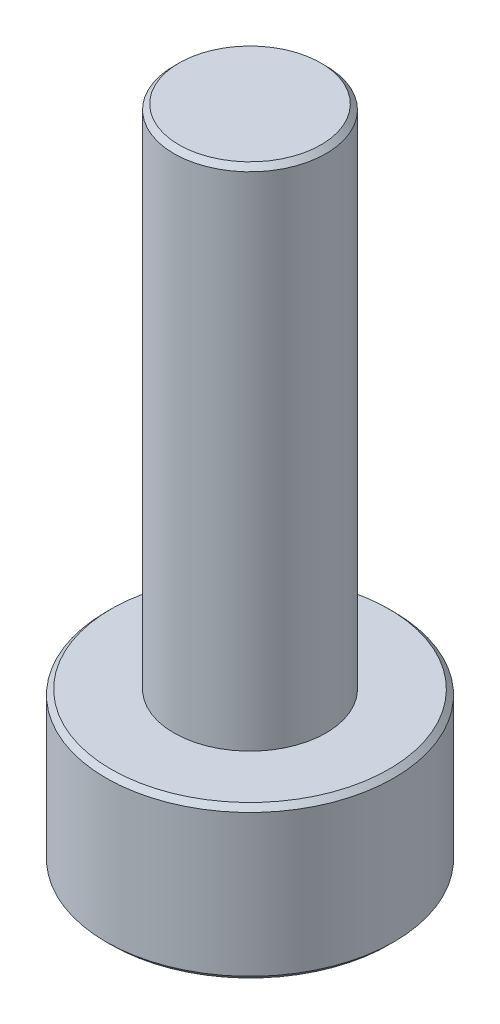
ISO-10303-21;
HEADER;
FILE_DESCRIPTION(('STEP AP214'),'2;1');
FILE_NAME('part.step','',(''),(''),'','','');
FILE_SCHEMA(('AUTOMOTIVE_DESIGN { 1 0 10303 214 1 1 1 1 }'));
ENDSEC;
DATA;
#1=APPLICATION_CONTEXT('core data for automotive mechanical design processes');
#2=APPLICATION_PROTOCOL_DEFINITION('international standard','automotive_design',2000,#1);
#3=PRODUCT_CONTEXT('',#1,'mechanical');
#4=PRODUCT('Part','Part','',(#3));
#5=PRODUCT_RELATED_PRODUCT_CATEGORY('part','',(#4));
#6=PRODUCT_DEFINITION_FORMATION('','',#4);
#7=PRODUCT_DEFINITION_CONTEXT('part definition',#1,'design');
#8=PRODUCT_DEFINITION('design','',#6,#7);
#9=PRODUCT_DEFINITION_SHAPE('','',#8);
#10=(LENGTH_UNIT() NAMED_UNIT(*) SI_UNIT(.MILLI.,.METRE.));
#11=(NAMED_UNIT(*) PLANE_ANGLE_UNIT() SI_UNIT($,.RADIAN.));
#12=(NAMED_UNIT(*) SI_UNIT($,.STERADIAN.) SOLID_ANGLE_UNIT());
#13=UNCERTAINTY_MEASURE_WITH_UNIT(LENGTH_MEASURE(1.E-05),#10,'distance_accuracy_value','');
#14=(GEOMETRIC_REPRESENTATION_CONTEXT(3) GLOBAL_UNCERTAINTY_ASSIGNED_CONTEXT((#13)) GLOBAL_UNIT_ASSIGNED_CONTEXT((#10,
#11,#12)) REPRESENTATION_CONTEXT('',''));
#15=CARTESIAN_POINT('',(0.,0.,0.));
#16=DIRECTION('',(0.,0.,1.));
#17=DIRECTION('',(1.,0.,0.));
#18=AXIS2_PLACEMENT_3D('',#15,#16,#17);
#19=CARTESIAN_POINT('',(0.,3.,0.));
#20=DIRECTION('',(0.,-1.,0.));
#21=DIRECTION('',(0.,0.,-1.));
#22=AXIS2_PLACEMENT_3D('',#19,#20,#21);
#23=CYLINDRICAL_SURFACE('',#22,2.84);
#24=CARTESIAN_POINT('',(0.,2.9,0.));
#25=DIRECTION('',(0.,1.,0.));
#26=DIRECTION('',(0.,0.,1.));
#27=AXIS2_PLACEMENT_3D('',#24,#25,#26);
#28=CIRCLE('',#27,2.84);
#29=CARTESIAN_POINT('',(0.,2.9,2.84));
#30=VERTEX_POINT('',#29);
#31=EDGE_CURVE('E51',#30,#30,#28,.F.);
#32=ORIENTED_EDGE('',*,*,#31,.T.);
#33=EDGE_LOOP('',(#32));
#34=FACE_BOUND('',#33,.T.);
#35=CARTESIAN_POINT('',(0.,0.100000000000001,0.));
#36=DIRECTION('',(0.,1.,0.));
#37=DIRECTION('',(0.,0.,1.));
#38=AXIS2_PLACEMENT_3D('',#35,#36,#37);
#39=CIRCLE('',#38,2.84);
#40=CARTESIAN_POINT('',(0.,0.100000000000001,2.84));
#41=VERTEX_POINT('',#40);
#42=EDGE_CURVE('E162',#41,#41,#39,.T.);
#43=ORIENTED_EDGE('',*,*,#42,.T.);
#44=EDGE_LOOP('',(#43));
#45=FACE_BOUND('',#44,.T.);
#46=ADVANCED_FACE('F43',(#34,#45),#23,.T.);
#47=CARTESIAN_POINT('',(0.,3.,0.));
#48=DIRECTION('',(0.,1.,0.));
#49=DIRECTION('',(0.,0.,1.));
#50=AXIS2_PLACEMENT_3D('',#47,#48,#49);
#51=PLANE('',#50);
#52=CARTESIAN_POINT('',(0.,3.,0.));
#53=DIRECTION('',(0.,1.,0.));
#54=DIRECTION('',(0.,0.,1.));
#55=AXIS2_PLACEMENT_3D('',#52,#53,#54);
#56=CIRCLE('',#55,2.74);
#57=CARTESIAN_POINT('',(0.,3.,2.74));
#58=VERTEX_POINT('',#57);
#59=EDGE_CURVE('E159',#58,#58,#56,.T.);
#60=ORIENTED_EDGE('',*,*,#59,.T.);
#61=EDGE_LOOP('',(#60));
#62=FACE_BOUND('',#61,.T.);
#63=CARTESIAN_POINT('',(0.,3.,0.));
#64=DIRECTION('',(0.,1.,0.));
#65=DIRECTION('',(0.,0.,1.));
#66=AXIS2_PLACEMENT_3D('',#63,#64,#65);
#67=CIRCLE('',#66,1.5);
#68=CARTESIAN_POINT('',(0.,3.,1.5));
#69=VERTEX_POINT('',#68);
#70=EDGE_CURVE('E145',#69,#69,#67,.T.);
#71=ORIENTED_EDGE('',*,*,#70,.F.);
#72=EDGE_LOOP('',(#71));
#73=FACE_BOUND('',#72,.T.);
#74=ADVANCED_FACE('F175',(#62,#73),#51,.T.);
#75=CARTESIAN_POINT('',(0.,0.,0.));
#76=DIRECTION('',(0.,1.,0.));
#77=DIRECTION('',(0.,0.,1.));
#78=AXIS2_PLACEMENT_3D('',#75,#76,#77);
#79=PLANE('',#78);
#80=CARTESIAN_POINT('',(0.,0.,0.));
#81=DIRECTION('',(0.,1.,0.));
#82=DIRECTION('',(0.,0.,1.));
#83=AXIS2_PLACEMENT_3D('',#80,#81,#82);
#84=CIRCLE('',#83,2.74);
#85=CARTESIAN_POINT('',(0.,0.,2.74));
#86=VERTEX_POINT('',#85);
#87=EDGE_CURVE('E11',#86,#86,#84,.F.);
#88=ORIENTED_EDGE('',*,*,#87,.T.);
#89=EDGE_LOOP('',(#88));
#90=FACE_BOUND('',#89,.T.);
#91=DIRECTION('',(0.,0.,1.));
#92=VECTOR('',#91,1.);
#93=CARTESIAN_POINT('',(1.29,0.,-0.744781847254618));
#94=LINE('',#93,#92);
#95=CARTESIAN_POINT('',(1.29,0.,-0.744781847254618));
#96=VERTEX_POINT('',#95);
#97=CARTESIAN_POINT('',(1.29,0.,0.744781847254619));
#98=VERTEX_POINT('',#97);
#99=EDGE_CURVE('E132',#96,#98,#94,.T.);
#100=ORIENTED_EDGE('',*,*,#99,.F.);
#101=DIRECTION('',(0.866025403784439,0.,0.5));
#102=VECTOR('',#101,1.);
#103=CARTESIAN_POINT('',(0.,0.,-1.48956369450924));
#104=LINE('',#103,#102);
#105=CARTESIAN_POINT('',(0.,0.,-1.48956369450924));
#106=VERTEX_POINT('',#105);
#107=EDGE_CURVE('E58',#106,#96,#104,.T.);
#108=ORIENTED_EDGE('',*,*,#107,.F.);
#109=DIRECTION('',(0.866025403784439,0.,-0.5));
#110=VECTOR('',#109,1.);
#111=CARTESIAN_POINT('',(-1.29,0.,-0.744781847254618));
#112=LINE('',#111,#110);
#113=CARTESIAN_POINT('',(-1.29,0.,-0.744781847254618));
#114=VERTEX_POINT('',#113);
#115=EDGE_CURVE('E141',#114,#106,#112,.T.);
#116=ORIENTED_EDGE('',*,*,#115,.F.);
#117=DIRECTION('',(0.,0.,-1.));
#118=VECTOR('',#117,1.);
#119=CARTESIAN_POINT('',(-1.29,0.,0.744781847254619));
#120=LINE('',#119,#118);
#121=CARTESIAN_POINT('',(-1.29,0.,0.744781847254619));
#122=VERTEX_POINT('',#121);
#123=EDGE_CURVE('E139',#122,#114,#120,.T.);
#124=ORIENTED_EDGE('',*,*,#123,.F.);
#125=DIRECTION('',(-0.866025403784439,0.,-0.5));
#126=VECTOR('',#125,1.);
#127=CARTESIAN_POINT('',(0.,0.,1.48956369450924));
#128=LINE('',#127,#126);
#129=CARTESIAN_POINT('',(0.,0.,1.48956369450924));
#130=VERTEX_POINT('',#129);
#131=EDGE_CURVE('E106',#130,#122,#128,.T.);
#132=ORIENTED_EDGE('',*,*,#131,.F.);
#133=DIRECTION('',(-0.866025403784439,0.,0.5));
#134=VECTOR('',#133,1.);
#135=CARTESIAN_POINT('',(1.29,0.,0.744781847254619));
#136=LINE('',#135,#134);
#137=EDGE_CURVE('E135',#98,#130,#136,.T.);
#138=ORIENTED_EDGE('',*,*,#137,.F.);
#139=EDGE_LOOP('',(#100,#108,#116,#124,#132,#138));
#140=FACE_BOUND('',#139,.T.);
#141=ADVANCED_FACE('F178',(#90,#140),#79,.F.);
#142=CARTESIAN_POINT('',(0.,13.,0.));
#143=DIRECTION('',(0.,-1.,0.));
#144=DIRECTION('',(0.,0.,-1.));
#145=AXIS2_PLACEMENT_3D('',#142,#143,#144);
#146=CYLINDRICAL_SURFACE('',#145,1.5);
#147=CARTESIAN_POINT('',(0.,12.9,0.));
#148=DIRECTION('',(0.,1.,0.));
#149=DIRECTION('',(0.,0.,1.));
#150=AXIS2_PLACEMENT_3D('',#147,#148,#149);
#151=CIRCLE('',#150,1.5);
#152=CARTESIAN_POINT('',(0.,12.9,1.5));
#153=VERTEX_POINT('',#152);
#154=EDGE_CURVE('E156',#153,#153,#151,.F.);
#155=ORIENTED_EDGE('',*,*,#154,.T.);
#156=EDGE_LOOP('',(#155));
#157=FACE_BOUND('',#156,.T.);
#158=ORIENTED_EDGE('',*,*,#70,.T.);
#159=EDGE_LOOP('',(#158));
#160=FACE_BOUND('',#159,.T.);
#161=ADVANCED_FACE('F182',(#157,#160),#146,.T.);
#162=CARTESIAN_POINT('',(0.,13.,0.));
#163=DIRECTION('',(0.,1.,0.));
#164=DIRECTION('',(0.,0.,1.));
#165=AXIS2_PLACEMENT_3D('',#162,#163,#164);
#166=PLANE('',#165);
#167=CARTESIAN_POINT('',(0.,13.,0.));
#168=DIRECTION('',(0.,1.,0.));
#169=DIRECTION('',(0.,0.,1.));
#170=AXIS2_PLACEMENT_3D('',#167,#168,#169);
#171=CIRCLE('',#170,1.4);
#172=CARTESIAN_POINT('',(0.,13.,1.4));
#173=VERTEX_POINT('',#172);
#174=EDGE_CURVE('E153',#173,#173,#171,.T.);
#175=ORIENTED_EDGE('',*,*,#174,.T.);
#176=EDGE_LOOP('',(#175));
#177=FACE_BOUND('',#176,.T.);
#178=ADVANCED_FACE('F184',(#177),#166,.T.);
#179=CARTESIAN_POINT('',(0.,1.3,-1.48956369450924));
#180=DIRECTION('',(0.5,0.,-0.866025403784439));
#181=DIRECTION('',(-0.866025403784439,0.,-0.5));
#182=AXIS2_PLACEMENT_3D('',#179,#180,#181);
#183=PLANE('',#182);
#184=ORIENTED_EDGE('',*,*,#107,.T.);
#185=DIRECTION('',(0.,-1.,0.));
#186=VECTOR('',#185,1.);
#187=CARTESIAN_POINT('',(1.29,1.3,-0.744781847254618));
#188=LINE('',#187,#186);
#189=CARTESIAN_POINT('',(1.29,1.3,-0.744781847254618));
#190=VERTEX_POINT('',#189);
#191=EDGE_CURVE('E88',#190,#96,#188,.T.);
#192=ORIENTED_EDGE('',*,*,#191,.F.);
#193=DIRECTION('',(0.866025403784439,0.,0.5));
#194=VECTOR('',#193,1.);
#195=CARTESIAN_POINT('',(0.,1.3,-1.48956369450924));
#196=LINE('',#195,#194);
#197=CARTESIAN_POINT('',(0.,1.3,-1.48956369450924));
#198=VERTEX_POINT('',#197);
#199=EDGE_CURVE('E143',#198,#190,#196,.T.);
#200=ORIENTED_EDGE('',*,*,#199,.F.);
#201=DIRECTION('',(0.,-1.,0.));
#202=VECTOR('',#201,1.);
#203=CARTESIAN_POINT('',(0.,1.3,-1.48956369450924));
#204=LINE('',#203,#202);
#205=EDGE_CURVE('E66',#198,#106,#204,.T.);
#206=ORIENTED_EDGE('',*,*,#205,.T.);
#207=EDGE_LOOP('',(#184,#192,#200,#206));
#208=FACE_BOUND('',#207,.T.);
#209=ADVANCED_FACE('F191',(#208),#183,.F.);
#210=CARTESIAN_POINT('',(-1.29,1.3,-0.744781847254618));
#211=DIRECTION('',(-0.5,0.,-0.866025403784439));
#212=DIRECTION('',(-0.866025403784439,0.,0.5));
#213=AXIS2_PLACEMENT_3D('',#210,#211,#212);
#214=PLANE('',#213);
#215=ORIENTED_EDGE('',*,*,#115,.T.);
#216=ORIENTED_EDGE('',*,*,#205,.F.);
#217=DIRECTION('',(0.866025403784439,0.,-0.5));
#218=VECTOR('',#217,1.);
#219=CARTESIAN_POINT('',(-1.29,1.3,-0.744781847254618));
#220=LINE('',#219,#218);
#221=CARTESIAN_POINT('',(-1.29,1.3,-0.744781847254618));
#222=VERTEX_POINT('',#221);
#223=EDGE_CURVE('E118',#222,#198,#220,.T.);
#224=ORIENTED_EDGE('',*,*,#223,.F.);
#225=DIRECTION('',(0.,-1.,0.));
#226=VECTOR('',#225,1.);
#227=CARTESIAN_POINT('',(-1.29,1.3,-0.744781847254618));
#228=LINE('',#227,#226);
#229=EDGE_CURVE('E110',#222,#114,#228,.T.);
#230=ORIENTED_EDGE('',*,*,#229,.T.);
#231=EDGE_LOOP('',(#215,#216,#224,#230));
#232=FACE_BOUND('',#231,.T.);
#233=ADVANCED_FACE('F218',(#232),#214,.F.);
#234=CARTESIAN_POINT('',(-1.29,1.3,0.744781847254619));
#235=DIRECTION('',(-1.,0.,0.));
#236=DIRECTION('',(0.,0.,1.));
#237=AXIS2_PLACEMENT_3D('',#234,#235,#236);
#238=PLANE('',#237);
#239=ORIENTED_EDGE('',*,*,#123,.T.);
#240=ORIENTED_EDGE('',*,*,#229,.F.);
#241=DIRECTION('',(0.,0.,-1.));
#242=VECTOR('',#241,1.);
#243=CARTESIAN_POINT('',(-1.29,1.3,0.744781847254619));
#244=LINE('',#243,#242);
#245=CARTESIAN_POINT('',(-1.29,1.3,0.744781847254619));
#246=VERTEX_POINT('',#245);
#247=EDGE_CURVE('E114',#246,#222,#244,.T.);
#248=ORIENTED_EDGE('',*,*,#247,.F.);
#249=DIRECTION('',(0.,-1.,0.));
#250=VECTOR('',#249,1.);
#251=CARTESIAN_POINT('',(-1.29,1.3,0.744781847254619));
#252=LINE('',#251,#250);
#253=EDGE_CURVE('E99',#246,#122,#252,.T.);
#254=ORIENTED_EDGE('',*,*,#253,.T.);
#255=EDGE_LOOP('',(#239,#240,#248,#254));
#256=FACE_BOUND('',#255,.T.);
#257=ADVANCED_FACE('F115',(#256),#238,.F.);
#258=CARTESIAN_POINT('',(0.,1.3,1.48956369450924));
#259=DIRECTION('',(-0.5,0.,0.866025403784439));
#260=DIRECTION('',(0.866025403784439,0.,0.5));
#261=AXIS2_PLACEMENT_3D('',#258,#259,#260);
#262=PLANE('',#261);
#263=ORIENTED_EDGE('',*,*,#131,.T.);
#264=ORIENTED_EDGE('',*,*,#253,.F.);
#265=DIRECTION('',(-0.866025403784439,0.,-0.5));
#266=VECTOR('',#265,1.);
#267=CARTESIAN_POINT('',(0.,1.3,1.48956369450924));
#268=LINE('',#267,#266);
#269=CARTESIAN_POINT('',(0.,1.3,1.48956369450924));
#270=VERTEX_POINT('',#269);
#271=EDGE_CURVE('E103',#270,#246,#268,.T.);
#272=ORIENTED_EDGE('',*,*,#271,.F.);
#273=DIRECTION('',(0.,-1.,0.));
#274=VECTOR('',#273,1.);
#275=CARTESIAN_POINT('',(0.,1.3,1.48956369450924));
#276=LINE('',#275,#274);
#277=EDGE_CURVE('E111',#270,#130,#276,.T.);
#278=ORIENTED_EDGE('',*,*,#277,.T.);
#279=EDGE_LOOP('',(#263,#264,#272,#278));
#280=FACE_BOUND('',#279,.T.);
#281=ADVANCED_FACE('F101',(#280),#262,.F.);
#282=CARTESIAN_POINT('',(1.29,1.3,0.744781847254619));
#283=DIRECTION('',(0.5,0.,0.866025403784439));
#284=DIRECTION('',(0.866025403784439,0.,-0.5));
#285=AXIS2_PLACEMENT_3D('',#282,#283,#284);
#286=PLANE('',#285);
#287=ORIENTED_EDGE('',*,*,#137,.T.);
#288=ORIENTED_EDGE('',*,*,#277,.F.);
#289=DIRECTION('',(-0.866025403784439,0.,0.5));
#290=VECTOR('',#289,1.);
#291=CARTESIAN_POINT('',(1.29,1.3,0.744781847254619));
#292=LINE('',#291,#290);
#293=CARTESIAN_POINT('',(1.29,1.3,0.744781847254619));
#294=VERTEX_POINT('',#293);
#295=EDGE_CURVE('E124',#294,#270,#292,.T.);
#296=ORIENTED_EDGE('',*,*,#295,.F.);
#297=DIRECTION('',(0.,-1.,0.));
#298=VECTOR('',#297,1.);
#299=CARTESIAN_POINT('',(1.29,1.3,0.744781847254619));
#300=LINE('',#299,#298);
#301=EDGE_CURVE('E148',#294,#98,#300,.T.);
#302=ORIENTED_EDGE('',*,*,#301,.T.);
#303=EDGE_LOOP('',(#287,#288,#296,#302));
#304=FACE_BOUND('',#303,.T.);
#305=ADVANCED_FACE('F214',(#304),#286,.F.);
#306=CARTESIAN_POINT('',(1.29,1.3,-0.744781847254618));
#307=DIRECTION('',(1.,0.,0.));
#308=DIRECTION('',(0.,0.,-1.));
#309=AXIS2_PLACEMENT_3D('',#306,#307,#308);
#310=PLANE('',#309);
#311=ORIENTED_EDGE('',*,*,#99,.T.);
#312=ORIENTED_EDGE('',*,*,#301,.F.);
#313=DIRECTION('',(0.,0.,1.));
#314=VECTOR('',#313,1.);
#315=CARTESIAN_POINT('',(1.29,1.3,-0.744781847254618));
#316=LINE('',#315,#314);
#317=EDGE_CURVE('E126',#190,#294,#316,.T.);
#318=ORIENTED_EDGE('',*,*,#317,.F.);
#319=ORIENTED_EDGE('',*,*,#191,.T.);
#320=EDGE_LOOP('',(#311,#312,#318,#319));
#321=FACE_BOUND('',#320,.T.);
#322=ADVANCED_FACE('F206',(#321),#310,.F.);
#323=CARTESIAN_POINT('',(0.,1.3,0.));
#324=DIRECTION('',(0.,-1.,0.));
#325=DIRECTION('',(0.,0.,-1.));
#326=AXIS2_PLACEMENT_3D('',#323,#324,#325);
#327=PLANE('',#326);
#328=ORIENTED_EDGE('',*,*,#199,.T.);
#329=ORIENTED_EDGE('',*,*,#317,.T.);
#330=ORIENTED_EDGE('',*,*,#295,.T.);
#331=ORIENTED_EDGE('',*,*,#271,.T.);
#332=ORIENTED_EDGE('',*,*,#247,.T.);
#333=ORIENTED_EDGE('',*,*,#223,.T.);
#334=EDGE_LOOP('',(#328,#329,#330,#331,#332,#333));
#335=FACE_BOUND('',#334,.T.);
#336=ADVANCED_FACE('F121',(#335),#327,.T.);
#337=CARTESIAN_POINT('',(0.,13.,0.));
#338=DIRECTION('',(0.,-1.,0.));
#339=DIRECTION('',(0.,0.,-1.));
#340=AXIS2_PLACEMENT_3D('',#337,#338,#339);
#341=CONICAL_SURFACE('',#340,1.4,0.785398163397444);
#342=ORIENTED_EDGE('',*,*,#154,.F.);
#343=EDGE_LOOP('',(#342));
#344=FACE_BOUND('',#343,.T.);
#345=ORIENTED_EDGE('',*,*,#174,.F.);
#346=EDGE_LOOP('',(#345));
#347=FACE_BOUND('',#346,.T.);
#348=ADVANCED_FACE('F172',(#344,#347),#341,.T.);
#349=CARTESIAN_POINT('',(0.,3.,0.));
#350=DIRECTION('',(0.,-1.,0.));
#351=DIRECTION('',(0.,0.,-1.));
#352=AXIS2_PLACEMENT_3D('',#349,#350,#351);
#353=CONICAL_SURFACE('',#352,2.74,0.78539816339744);
#354=ORIENTED_EDGE('',*,*,#31,.F.);
#355=EDGE_LOOP('',(#354));
#356=FACE_BOUND('',#355,.T.);
#357=ORIENTED_EDGE('',*,*,#59,.F.);
#358=EDGE_LOOP('',(#357));
#359=FACE_BOUND('',#358,.T.);
#360=ADVANCED_FACE('F169',(#356,#359),#353,.T.);
#361=CARTESIAN_POINT('',(0.,0.100000000000001,0.));
#362=DIRECTION('',(0.,1.,0.));
#363=DIRECTION('',(0.,0.,1.));
#364=AXIS2_PLACEMENT_3D('',#361,#362,#363);
#365=CONICAL_SURFACE('',#364,2.84,0.785398163397438);
#366=ORIENTED_EDGE('',*,*,#87,.F.);
#367=EDGE_LOOP('',(#366));
#368=FACE_BOUND('',#367,.T.);
#369=ORIENTED_EDGE('',*,*,#42,.F.);
#370=EDGE_LOOP('',(#369));
#371=FACE_BOUND('',#370,.T.);
#372=ADVANCED_FACE('F45',(#368,#371),#365,.T.);
#373=CLOSED_SHELL('',(#46,#74,#141,#161,#178,#209,#233,#257,#281,#305,#322,#336,#348,#360,#372));
#374=MANIFOLD_SOLID_BREP('B2',#373);
#375=ADVANCED_BREP_SHAPE_REPRESENTATION('',(#18,#374),#14);
#376=SHAPE_DEFINITION_REPRESENTATION(#9,#375);
ENDSEC;
END-ISO-10303-21;
